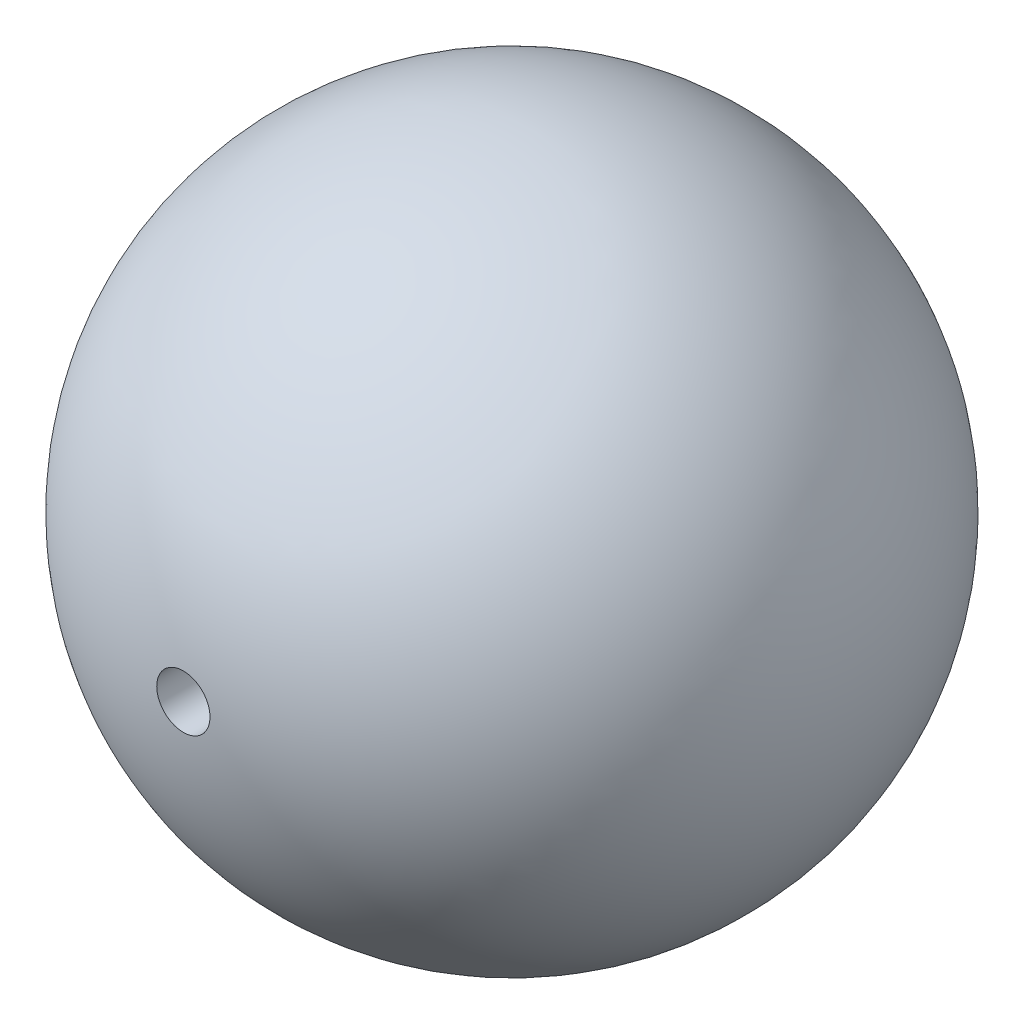
ISO-10303-21;
HEADER;
FILE_DESCRIPTION(('STEP AP214'),'2;1');
FILE_NAME('part.step','',(''),(''),'','','');
FILE_SCHEMA(('AUTOMOTIVE_DESIGN { 1 0 10303 214 1 1 1 1 }'));
ENDSEC;
DATA;
#1=APPLICATION_CONTEXT('core data for automotive mechanical design processes');
#2=APPLICATION_PROTOCOL_DEFINITION('international standard','automotive_design',2000,#1);
#3=PRODUCT_CONTEXT('',#1,'mechanical');
#4=PRODUCT('Part','Part','',(#3));
#5=PRODUCT_RELATED_PRODUCT_CATEGORY('part','',(#4));
#6=PRODUCT_DEFINITION_FORMATION('','',#4);
#7=PRODUCT_DEFINITION_CONTEXT('part definition',#1,'design');
#8=PRODUCT_DEFINITION('design','',#6,#7);
#9=PRODUCT_DEFINITION_SHAPE('','',#8);
#10=(LENGTH_UNIT() NAMED_UNIT(*) SI_UNIT(.MILLI.,.METRE.));
#11=(NAMED_UNIT(*) PLANE_ANGLE_UNIT() SI_UNIT($,.RADIAN.));
#12=(NAMED_UNIT(*) SI_UNIT($,.STERADIAN.) SOLID_ANGLE_UNIT());
#13=UNCERTAINTY_MEASURE_WITH_UNIT(LENGTH_MEASURE(1.E-05),#10,'distance_accuracy_value','');
#14=(GEOMETRIC_REPRESENTATION_CONTEXT(3) GLOBAL_UNCERTAINTY_ASSIGNED_CONTEXT((#13)) GLOBAL_UNIT_ASSIGNED_CONTEXT((#10,
#11,#12)) REPRESENTATION_CONTEXT('',''));
#15=CARTESIAN_POINT('',(0.,0.,0.));
#16=DIRECTION('',(0.,0.,1.));
#17=DIRECTION('',(1.,0.,0.));
#18=AXIS2_PLACEMENT_3D('',#15,#16,#17);
#19=CARTESIAN_POINT('',(0.,0.,0.));
#20=DIRECTION('',(0.,0.,1.));
#21=DIRECTION('',(-1.,0.,0.));
#22=AXIS2_PLACEMENT_3D('',#19,#20,#21);
#23=SPHERICAL_SURFACE('',#22,9.9);
#24=CARTESIAN_POINT('',(0.,0.,9.86762382744701));
#25=DIRECTION('',(0.,0.,-1.));
#26=DIRECTION('',(-1.,0.,0.));
#27=AXIS2_PLACEMENT_3D('',#24,#25,#26);
#28=CIRCLE('',#27,0.8);
#29=CARTESIAN_POINT('',(-0.800000000000041,0.,9.86762382744701));
#30=VERTEX_POINT('',#29);
#31=EDGE_CURVE('E10',#30,#30,#28,.F.);
#32=CARTESIAN_POINT('',(0.,0.,-9.86762382744701));
#33=DIRECTION('',(0.,0.,1.));
#34=DIRECTION('',(1.,0.,0.));
#35=AXIS2_PLACEMENT_3D('',#32,#33,#34);
#36=CIRCLE('',#35,0.8);
#37=CARTESIAN_POINT('',(-0.799999999999962,0.,-9.86762382744701));
#38=VERTEX_POINT('',#37);
#39=EDGE_CURVE('E40',#38,#38,#36,.F.);
#40=CARTESIAN_POINT('',(-0.800000000000041,0.,9.86762382744701));
#41=CARTESIAN_POINT('',(-0.953143820218918,0.,9.85521075601492));
#42=CARTESIAN_POINT('',(-1.10599793844031,0.,9.83922712448755));
#43=CARTESIAN_POINT('',(-1.41079703138169,0.,9.80016551072087));
#44=CARTESIAN_POINT('',(-1.56274200610167,0.,9.77708752848156));
#45=CARTESIAN_POINT('',(-1.86539307253377,0.,9.7238839827696));
#46=CARTESIAN_POINT('',(-2.0160991642459,0.,9.69375841929696));
#47=CARTESIAN_POINT('',(-2.31594593827496,0.,9.62652587544687));
#48=CARTESIAN_POINT('',(-2.46508662059189,0.,9.58941889506943));
#49=CARTESIAN_POINT('',(-2.76147930081356,0.,9.508303709189));
#50=CARTESIAN_POINT('',(-2.90873129871829,0.,9.464295503686));
#51=CARTESIAN_POINT('',(-3.20102746651033,0.,9.36947331274349));
#52=CARTESIAN_POINT('',(-3.34607163639765,0.,9.31865932730397));
#53=CARTESIAN_POINT('',(-3.63363777960336,0.,9.21033569315482));
#54=CARTESIAN_POINT('',(-3.77615975292176,0.,9.15282604444519));
#55=CARTESIAN_POINT('',(-4.05837260372812,0.,9.03123573373315));
#56=CARTESIAN_POINT('',(-4.19806348121608,0.,8.96715507173074));
#57=CARTESIAN_POINT('',(-4.47431137644244,0.,8.83256162062851));
#58=CARTESIAN_POINT('',(-4.61086839418083,0.,8.76204883152871));
#59=CARTESIAN_POINT('',(-4.88055259846163,0.,8.61474395484088));
#60=CARTESIAN_POINT('',(-5.01367978500404,0.,8.53795186725286));
#61=CARTESIAN_POINT('',(-5.27621578915514,0.,8.37825483143995));
#62=CARTESIAN_POINT('',(-5.40562460676384,0.,8.29534988321506));
#63=CARTESIAN_POINT('',(-5.66044339445698,0.,8.12360681300522));
#64=CARTESIAN_POINT('',(-5.78585336454141,0.,8.03476869102027));
#65=CARTESIAN_POINT('',(-6.03240264562962,0.,7.85135181960334));
#66=CARTESIAN_POINT('',(-6.15354195663339,0.,7.75677307017136));
#67=CARTESIAN_POINT('',(-6.3912873641628,0.,7.56207993232501));
#68=CARTESIAN_POINT('',(-6.50789346068844,0.,7.46196554391064));
#69=CARTESIAN_POINT('',(-6.73631970908011,0.,7.2564181144171));
#70=CARTESIAN_POINT('',(-6.84813986094615,0.,7.15098507333794));
#71=CARTESIAN_POINT('',(-7.06675186281685,0.,6.93502885239534));
#72=CARTESIAN_POINT('',(-7.17354371282152,0.,6.82450567253192));
#73=CARTESIAN_POINT('',(-7.38186765202838,0.,6.59860872018628));
#74=CARTESIAN_POINT('',(-7.48339974123059,0.,6.48323494770407));
#75=CARTESIAN_POINT('',(-7.68098409981259,0.,6.24788686938292));
#76=CARTESIAN_POINT('',(-7.77703636919239,0.,6.12791256354399));
#77=CARTESIAN_POINT('',(-7.96345290598311,0.,5.88362344889361));
#78=CARTESIAN_POINT('',(-8.05381717339403,0.,5.75930864008215));
#79=CARTESIAN_POINT('',(-8.22866185218469,0.,5.50660795740735));
#80=CARTESIAN_POINT('',(-8.31314226356442,0.,5.37822208354401));
#81=CARTESIAN_POINT('',(-8.47603612880547,0.,5.11765753224713));
#82=CARTESIAN_POINT('',(-8.55444958266679,0.,4.98547885481359));
#83=CARTESIAN_POINT('',(-8.70503958081011,0.,4.71761517831953));
#84=CARTESIAN_POINT('',(-8.7772161250921,0.,4.58193017925902));
#85=CARTESIAN_POINT('',(-8.91517586979355,0.,4.30734794099946));
#86=CARTESIAN_POINT('',(-8.98095907021299,0.,4.16845070180042));
#87=CARTESIAN_POINT('',(-9.10598954973695,0.,3.88774502690993));
#88=CARTESIAN_POINT('',(-9.16523682884146,0.,3.74593659121848));
#89=CARTESIAN_POINT('',(-9.27706705413408,0.,3.45971587666987));
#90=CARTESIAN_POINT('',(-9.32965000032218,0.,3.3153035978127));
#91=CARTESIAN_POINT('',(-9.42803759234867,0.,3.02418819378717));
#92=CARTESIAN_POINT('',(-9.47384223818706,0.,2.87748506861882));
#93=CARTESIAN_POINT('',(-9.55857395326016,0.,2.58210593396898));
#94=CARTESIAN_POINT('',(-9.59750102249488,0.,2.4334299244875));
#95=CARTESIAN_POINT('',(-9.66839321445578,0.,2.13442725920725));
#96=CARTESIAN_POINT('',(-9.70035833718196,0.,1.98410060340848));
#97=CARTESIAN_POINT('',(-9.75725735543203,0.,1.68212246107381));
#98=CARTESIAN_POINT('',(-9.78219125095591,0.,1.53047097453792));
#99=CARTESIAN_POINT('',(-9.82497377347655,0.,1.22617185772605));
#100=CARTESIAN_POINT('',(-9.84282240047331,0.,1.07352422745006));
#101=CARTESIAN_POINT('',(-9.87139570111212,0.,0.767563669180996));
#102=CARTESIAN_POINT('',(-9.88212037475417,0.,0.614250741187909));
#103=CARTESIAN_POINT('',(-9.89642252419811,0.,0.307291875463202));
#104=CARTESIAN_POINT('',(-9.9,0.,0.153645937731581));
#105=CARTESIAN_POINT('',(-9.9,0.,-0.15364593773166));
#106=CARTESIAN_POINT('',(-9.89642252419811,0.,-0.307291875463281));
#107=CARTESIAN_POINT('',(-9.88212037475417,0.,-0.614250741187988));
#108=CARTESIAN_POINT('',(-9.87139570111212,0.,-0.767563669181075));
#109=CARTESIAN_POINT('',(-9.8428224004733,0.,-1.07352422745014));
#110=CARTESIAN_POINT('',(-9.82497377347654,0.,-1.22617185772612));
#111=CARTESIAN_POINT('',(-9.7821912509559,0.,-1.530470974538));
#112=CARTESIAN_POINT('',(-9.75725735543201,0.,-1.68212246107389));
#113=CARTESIAN_POINT('',(-9.70035833718194,0.,-1.98410060340855));
#114=CARTESIAN_POINT('',(-9.66839321445576,0.,-2.13442725920732));
#115=CARTESIAN_POINT('',(-9.59750102249486,0.,-2.43342992448758));
#116=CARTESIAN_POINT('',(-9.55857395326014,0.,-2.58210593396906));
#117=CARTESIAN_POINT('',(-9.47384223818704,0.,-2.8774850686189));
#118=CARTESIAN_POINT('',(-9.42803759234865,0.,-3.02418819378725));
#119=CARTESIAN_POINT('',(-9.32965000032215,0.,-3.31530359781277));
#120=CARTESIAN_POINT('',(-9.27706705413405,0.,-3.45971587666994));
#121=CARTESIAN_POINT('',(-9.16523682884143,0.,-3.74593659121856));
#122=CARTESIAN_POINT('',(-9.10598954973692,0.,-3.88774502691));
#123=CARTESIAN_POINT('',(-8.98095907021296,0.,-4.16845070180049));
#124=CARTESIAN_POINT('',(-8.91517586979351,0.,-4.30734794099953));
#125=CARTESIAN_POINT('',(-8.77721612509207,0.,-4.58193017925909));
#126=CARTESIAN_POINT('',(-8.70503958081007,0.,-4.7176151783196));
#127=CARTESIAN_POINT('',(-8.55444958266675,0.,-4.98547885481366));
#128=CARTESIAN_POINT('',(-8.47603612880543,0.,-5.1176575322472));
#129=CARTESIAN_POINT('',(-8.31314226356438,0.,-5.37822208354408));
#130=CARTESIAN_POINT('',(-8.22866185218464,0.,-5.50660795740741));
#131=CARTESIAN_POINT('',(-8.05381717339398,0.,-5.75930864008221));
#132=CARTESIAN_POINT('',(-7.96345290598306,0.,-5.88362344889367));
#133=CARTESIAN_POINT('',(-7.77703636919234,0.,-6.12791256354406));
#134=CARTESIAN_POINT('',(-7.68098409981254,0.,-6.24788686938299));
#135=CARTESIAN_POINT('',(-7.48339974123054,0.,-6.48323494770413));
#136=CARTESIAN_POINT('',(-7.38186765202833,0.,-6.59860872018634));
#137=CARTESIAN_POINT('',(-7.17354371282146,0.,-6.82450567253197));
#138=CARTESIAN_POINT('',(-7.0667518628168,0.,-6.9350288523954));
#139=CARTESIAN_POINT('',(-6.8481398609461,0.,-7.15098507333799));
#140=CARTESIAN_POINT('',(-6.73631970908006,0.,-7.25641811441716));
#141=CARTESIAN_POINT('',(-6.50789346068838,0.,-7.4619655439107));
#142=CARTESIAN_POINT('',(-6.39128736416274,0.,-7.56207993232506));
#143=CARTESIAN_POINT('',(-6.15354195663333,0.,-7.75677307017141));
#144=CARTESIAN_POINT('',(-6.03240264562956,0.,-7.85135181960339));
#145=CARTESIAN_POINT('',(-5.78585336454135,0.,-8.03476869102032));
#146=CARTESIAN_POINT('',(-5.66044339445691,0.,-8.12360681300526));
#147=CARTESIAN_POINT('',(-5.40562460676377,0.,-8.2953498832151));
#148=CARTESIAN_POINT('',(-5.27621578915507,0.,-8.37825483143999));
#149=CARTESIAN_POINT('',(-5.01367978500397,0.,-8.5379518672529));
#150=CARTESIAN_POINT('',(-4.88055259846156,0.,-8.61474395484092));
#151=CARTESIAN_POINT('',(-4.61086839418076,0.,-8.76204883152874));
#152=CARTESIAN_POINT('',(-4.47431137644237,0.,-8.83256162062855));
#153=CARTESIAN_POINT('',(-4.19806348121601,0.,-8.96715507173077));
#154=CARTESIAN_POINT('',(-4.05837260372804,0.,-9.03123573373318));
#155=CARTESIAN_POINT('',(-3.77615975292168,0.,-9.15282604444522));
#156=CARTESIAN_POINT('',(-3.63363777960329,0.,-9.21033569315485));
#157=CARTESIAN_POINT('',(-3.34607163639757,0.,-9.318659327304));
#158=CARTESIAN_POINT('',(-3.20102746651026,0.,-9.36947331274352));
#159=CARTESIAN_POINT('',(-2.90873129871821,0.,-9.46429550368603));
#160=CARTESIAN_POINT('',(-2.76147930081348,0.,-9.50830370918902));
#161=CARTESIAN_POINT('',(-2.46508662059182,0.,-9.58941889506945));
#162=CARTESIAN_POINT('',(-2.31594593827488,0.,-9.62652587544689));
#163=CARTESIAN_POINT('',(-2.01609916424582,0.,-9.69375841929697));
#164=CARTESIAN_POINT('',(-1.8653930725337,0.,-9.72388398276961));
#165=CARTESIAN_POINT('',(-1.56274200610159,0.,-9.77708752848157));
#166=CARTESIAN_POINT('',(-1.41079703138161,0.,-9.80016551072088));
#167=CARTESIAN_POINT('',(-1.10599793844023,0.,-9.83922712448756));
#168=CARTESIAN_POINT('',(-0.953143820218838,0.,-9.85521075601493));
#169=CARTESIAN_POINT('',(-0.799999999999962,0.,-9.86762382744701));
#170=B_SPLINE_CURVE_WITH_KNOTS('',3,(#40,#41,#42,#43,#44,#45,#46,#47,#48,#49,#50,#51,#52,#53,
#54,#55,#56,#57,#58,#59,#60,#61,#62,#63,#64,#65,#66,#67,#68,#69,#70,#71,#72,#73,#74,#75,#76,#77,
#78,#79,#80,#81,#82,#83,#84,#85,#86,#87,#88,#89,#90,#91,#92,#93,#94,#95,#96,#97,#98,#99,#100,
#101,#102,#103,#104,#105,#106,#107,#108,#109,#110,#111,#112,#113,#114,#115,#116,#117,#118,#119,
#120,#121,#122,#123,#124,#125,#126,#127,#128,#129,#130,#131,#132,#133,#134,#135,#136,#137,#138,
#139,#140,#141,#142,#143,#144,#145,#146,#147,#148,#149,#150,#151,#152,#153,#154,#155,#156,#157,
#158,#159,#160,#161,#162,#163,#164,#165,#166,#167,#168,#169),.UNSPECIFIED.,.F.,.F.,(4,2,2,2,2,2,
2,2,2,2,2,2,2,2,2,2,2,2,2,2,2,2,2,2,2,2,2,2,2,2,2,2,2,2,2,2,2,2,2,2,2,2,2,2,2,2,2,2,2,2,2,2,2,2,
2,2,2,2,2,2,2,2,2,2,4),(0.,0.460896192620881,0.921792385241759,1.38268857786264,
1.84358477048352,2.3044809631044,2.76537715572528,3.22627334834616,3.68716954096704,
4.14806573358792,4.6089619262088,5.06985811882968,5.53075431145056,5.99165050407144,
6.45254669669232,6.9134428893132,7.37433908193408,7.83523527455496,8.29613146717584,
8.75702765979672,9.2179238524176,9.67882004503848,10.1397162376594,10.6006124302802,
11.0615086229011,11.522404815522,11.9833010081429,12.4441972007638,12.9050933933846,
13.3659895860055,13.8268857786264,14.2877819712473,14.7486781638682,15.209574356489,
15.6704705491099,16.1313667417308,16.5922629343517,17.0531591269725,17.5140553195934,
17.9749515122143,18.4358477048352,18.8967438974561,19.3576400900769,19.8185362826978,
20.2794324753187,20.7403286679396,21.2012248605605,21.6621210531814,22.1230172458022,
22.5839134384231,23.044809631044,23.5057058236649,23.9666020162858,24.4274982089066,
24.8883944015275,25.3492905941484,25.8101867867693,26.2710829793902,26.731979172011,
27.1928753646319,27.6537715572528,28.1146677498737,28.5755639424945,29.0364601351154,
29.4973563277363),.UNSPECIFIED.);
#171=EDGE_CURVE('BSEAM34',#30,#38,#170,.T.);
#172=ORIENTED_EDGE('',*,*,#31,.F.);
#173=ORIENTED_EDGE('',*,*,#39,.F.);
#174=ORIENTED_EDGE('',*,*,#171,.T.);
#175=ORIENTED_EDGE('',*,*,#171,.F.);
#176=EDGE_LOOP('',(#172,#174,#173,#175));
#177=FACE_BOUND('',#176,.T.);
#178=ADVANCED_FACE('F34',(#177),#23,.T.);
#179=CARTESIAN_POINT('',(0.,0.,-9.9));
#180=DIRECTION('',(0.,0.,1.));
#181=DIRECTION('',(1.,0.,0.));
#182=AXIS2_PLACEMENT_3D('',#179,#180,#181);
#183=CYLINDRICAL_SURFACE('',#182,0.8);
#184=ORIENTED_EDGE('',*,*,#31,.T.);
#185=EDGE_LOOP('',(#184));
#186=FACE_BOUND('',#185,.T.);
#187=ORIENTED_EDGE('',*,*,#39,.T.);
#188=EDGE_LOOP('',(#187));
#189=FACE_BOUND('',#188,.T.);
#190=ADVANCED_FACE('F46',(#186,#189),#183,.F.);
#191=CLOSED_SHELL('',(#178,#190));
#192=MANIFOLD_SOLID_BREP('B2',#191);
#193=ADVANCED_BREP_SHAPE_REPRESENTATION('',(#18,#192),#14);
#194=SHAPE_DEFINITION_REPRESENTATION(#9,#193);
ENDSEC;
END-ISO-10303-21;
